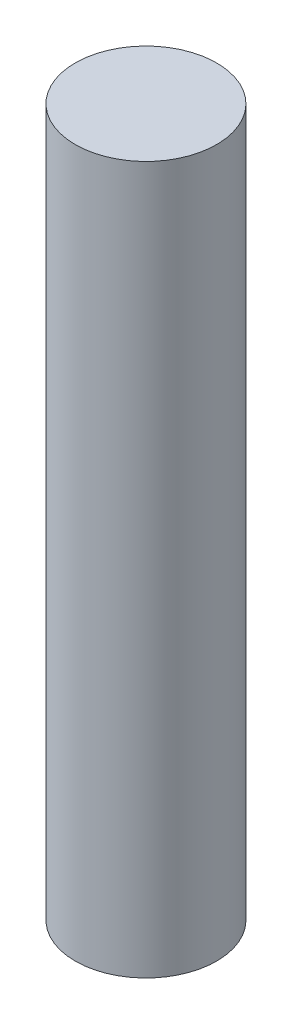
ISO-10303-21;
HEADER;
FILE_DESCRIPTION(('STEP AP214'),'2;1');
FILE_NAME('part.step','',(''),(''),'','','');
FILE_SCHEMA(('AUTOMOTIVE_DESIGN { 1 0 10303 214 1 1 1 1 }'));
ENDSEC;
DATA;
#1=APPLICATION_CONTEXT('core data for automotive mechanical design processes');
#2=APPLICATION_PROTOCOL_DEFINITION('international standard','automotive_design',2000,#1);
#3=PRODUCT_CONTEXT('',#1,'mechanical');
#4=PRODUCT('Part','Part','',(#3));
#5=PRODUCT_RELATED_PRODUCT_CATEGORY('part','',(#4));
#6=PRODUCT_DEFINITION_FORMATION('','',#4);
#7=PRODUCT_DEFINITION_CONTEXT('part definition',#1,'design');
#8=PRODUCT_DEFINITION('design','',#6,#7);
#9=PRODUCT_DEFINITION_SHAPE('','',#8);
#10=(LENGTH_UNIT() NAMED_UNIT(*) SI_UNIT(.MILLI.,.METRE.));
#11=(NAMED_UNIT(*) PLANE_ANGLE_UNIT() SI_UNIT($,.RADIAN.));
#12=(NAMED_UNIT(*) SI_UNIT($,.STERADIAN.) SOLID_ANGLE_UNIT());
#13=UNCERTAINTY_MEASURE_WITH_UNIT(LENGTH_MEASURE(1.E-05),#10,'distance_accuracy_value','');
#14=(GEOMETRIC_REPRESENTATION_CONTEXT(3) GLOBAL_UNCERTAINTY_ASSIGNED_CONTEXT((#13)) GLOBAL_UNIT_ASSIGNED_CONTEXT((#10,
#11,#12)) REPRESENTATION_CONTEXT('',''));
#15=CARTESIAN_POINT('',(0.,0.,0.));
#16=DIRECTION('',(0.,0.,1.));
#17=DIRECTION('',(1.,0.,0.));
#18=AXIS2_PLACEMENT_3D('',#15,#16,#17);
#19=CARTESIAN_POINT('',(0.,10.,0.));
#20=DIRECTION('',(0.,-1.,0.));
#21=DIRECTION('',(0.,0.,-1.));
#22=AXIS2_PLACEMENT_3D('',#19,#20,#21);
#23=CYLINDRICAL_SURFACE('',#22,0.999999999999999);
#24=CARTESIAN_POINT('',(0.,10.,0.));
#25=DIRECTION('',(0.,1.,0.));
#26=DIRECTION('',(0.,0.,1.));
#27=AXIS2_PLACEMENT_3D('',#24,#25,#26);
#28=CIRCLE('',#27,0.999999999999999);
#29=CARTESIAN_POINT('',(0.,10.,0.999999999999999));
#30=VERTEX_POINT('',#29);
#31=EDGE_CURVE('E10',#30,#30,#28,.T.);
#32=ORIENTED_EDGE('',*,*,#31,.F.);
#33=EDGE_LOOP('',(#32));
#34=FACE_BOUND('',#33,.T.);
#35=CARTESIAN_POINT('',(0.,0.,0.));
#36=DIRECTION('',(0.,1.,0.));
#37=DIRECTION('',(0.,0.,1.));
#38=AXIS2_PLACEMENT_3D('',#35,#36,#37);
#39=CIRCLE('',#38,0.999999999999999);
#40=CARTESIAN_POINT('',(0.,0.,0.999999999999999));
#41=VERTEX_POINT('',#40);
#42=EDGE_CURVE('E34',#41,#41,#39,.T.);
#43=ORIENTED_EDGE('',*,*,#42,.T.);
#44=EDGE_LOOP('',(#43));
#45=FACE_BOUND('',#44,.T.);
#46=ADVANCED_FACE('F31',(#34,#45),#23,.T.);
#47=CARTESIAN_POINT('',(0.,10.,0.));
#48=DIRECTION('',(0.,1.,0.));
#49=DIRECTION('',(0.,0.,1.));
#50=AXIS2_PLACEMENT_3D('',#47,#48,#49);
#51=PLANE('',#50);
#52=ORIENTED_EDGE('',*,*,#31,.T.);
#53=EDGE_LOOP('',(#52));
#54=FACE_BOUND('',#53,.T.);
#55=ADVANCED_FACE('F46',(#54),#51,.T.);
#56=CARTESIAN_POINT('',(0.,0.,0.));
#57=DIRECTION('',(0.,1.,0.));
#58=DIRECTION('',(0.,0.,1.));
#59=AXIS2_PLACEMENT_3D('',#56,#57,#58);
#60=PLANE('',#59);
#61=ORIENTED_EDGE('',*,*,#42,.F.);
#62=EDGE_LOOP('',(#61));
#63=FACE_BOUND('',#62,.T.);
#64=ADVANCED_FACE('F44',(#63),#60,.F.);
#65=CLOSED_SHELL('',(#46,#55,#64));
#66=MANIFOLD_SOLID_BREP('B2',#65);
#67=ADVANCED_BREP_SHAPE_REPRESENTATION('',(#18,#66),#14);
#68=SHAPE_DEFINITION_REPRESENTATION(#9,#67);
ENDSEC;
END-ISO-10303-21;
